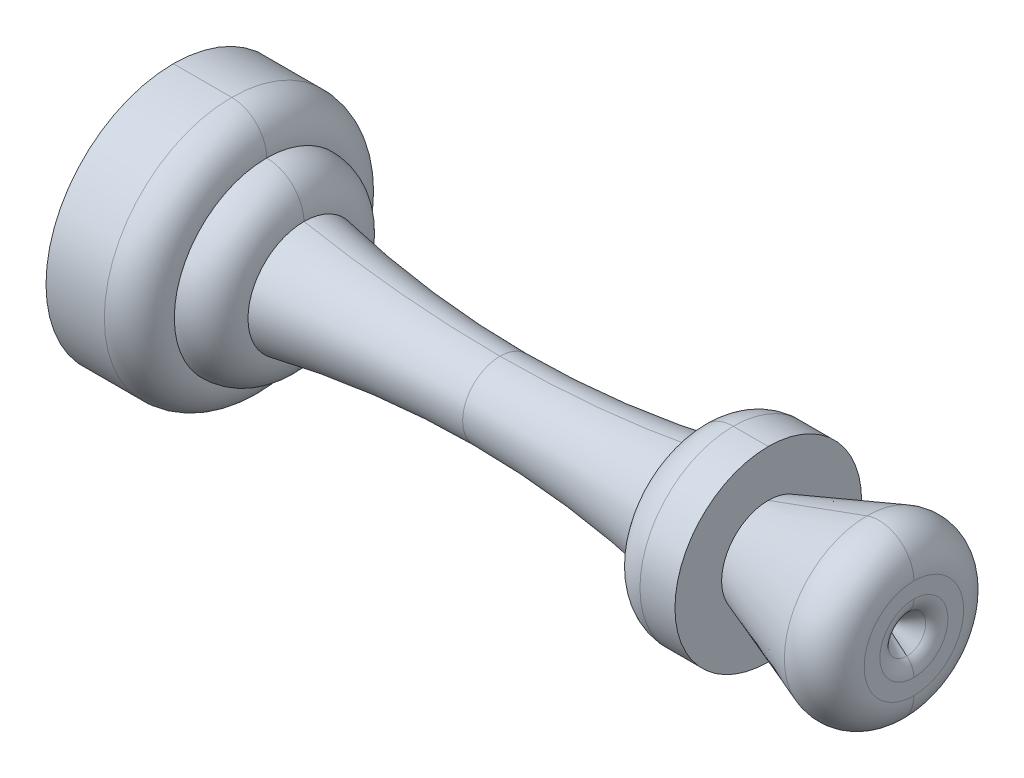
ISO-10303-21;
HEADER;
FILE_DESCRIPTION(('STEP AP214'),'2;1');
FILE_NAME('part.step','',(''),(''),'','','');
FILE_SCHEMA(('AUTOMOTIVE_DESIGN { 1 0 10303 214 1 1 1 1 }'));
ENDSEC;
DATA;
#1=APPLICATION_CONTEXT('core data for automotive mechanical design processes');
#2=APPLICATION_PROTOCOL_DEFINITION('international standard','automotive_design',2000,#1);
#3=PRODUCT_CONTEXT('',#1,'mechanical');
#4=PRODUCT('Part','Part','',(#3));
#5=PRODUCT_RELATED_PRODUCT_CATEGORY('part','',(#4));
#6=PRODUCT_DEFINITION_FORMATION('','',#4);
#7=PRODUCT_DEFINITION_CONTEXT('part definition',#1,'design');
#8=PRODUCT_DEFINITION('design','',#6,#7);
#9=PRODUCT_DEFINITION_SHAPE('','',#8);
#10=(LENGTH_UNIT() NAMED_UNIT(*) SI_UNIT(.MILLI.,.METRE.));
#11=(NAMED_UNIT(*) PLANE_ANGLE_UNIT() SI_UNIT($,.RADIAN.));
#12=(NAMED_UNIT(*) SI_UNIT($,.STERADIAN.) SOLID_ANGLE_UNIT());
#13=UNCERTAINTY_MEASURE_WITH_UNIT(LENGTH_MEASURE(1.E-05),#10,'distance_accuracy_value','');
#14=(GEOMETRIC_REPRESENTATION_CONTEXT(3) GLOBAL_UNCERTAINTY_ASSIGNED_CONTEXT((#13)) GLOBAL_UNIT_ASSIGNED_CONTEXT((#10,
#11,#12)) REPRESENTATION_CONTEXT('',''));
#15=CARTESIAN_POINT('',(0.,0.,0.));
#16=DIRECTION('',(0.,0.,1.));
#17=DIRECTION('',(1.,0.,0.));
#18=AXIS2_PLACEMENT_3D('',#15,#16,#17);
#19=CARTESIAN_POINT('',(0.,10.9184262916031,0.));
#20=DIRECTION('',(-1.,0.,0.));
#21=DIRECTION('',(0.,-1.,0.));
#22=AXIS2_PLACEMENT_3D('',#19,#20,#21);
#23=CYLINDRICAL_SURFACE('',#22,10.9184262916031);
#24=DIRECTION('',(-1.,0.,0.));
#25=VECTOR('',#24,1.);
#26=CARTESIAN_POINT('',(0.,21.8368525832062,0.));
#27=LINE('',#26,#25);
#28=CARTESIAN_POINT('',(5.,21.8368525832062,0.));
#29=VERTEX_POINT('',#28);
#30=CARTESIAN_POINT('',(0.,21.8368525832062,0.));
#31=VERTEX_POINT('',#30);
#32=EDGE_CURVE('E235',#29,#31,#27,.T.);
#33=ORIENTED_EDGE('',*,*,#32,.F.);
#34=CARTESIAN_POINT('',(5.,10.9184262916031,0.));
#35=DIRECTION('',(-1.,0.,0.));
#36=DIRECTION('',(0.,-1.,0.));
#37=AXIS2_PLACEMENT_3D('',#34,#35,#36);
#38=CIRCLE('',#37,10.9184262916031);
#39=CARTESIAN_POINT('',(5.,0.,0.));
#40=VERTEX_POINT('',#39);
#41=EDGE_CURVE('E341',#29,#40,#38,.T.);
#42=ORIENTED_EDGE('',*,*,#41,.T.);
#43=DIRECTION('',(-1.,0.,0.));
#44=VECTOR('',#43,1.);
#45=CARTESIAN_POINT('',(0.,0.,0.));
#46=LINE('',#45,#44);
#47=CARTESIAN_POINT('',(0.,0.,0.));
#48=VERTEX_POINT('',#47);
#49=EDGE_CURVE('E243',#40,#48,#46,.T.);
#50=ORIENTED_EDGE('',*,*,#49,.T.);
#51=CARTESIAN_POINT('',(0.,10.9184262916031,0.));
#52=DIRECTION('',(-1.,0.,0.));
#53=DIRECTION('',(0.,-1.,0.));
#54=AXIS2_PLACEMENT_3D('',#51,#52,#53);
#55=CIRCLE('',#54,10.9184262916031);
#56=EDGE_CURVE('E362',#31,#48,#55,.T.);
#57=ORIENTED_EDGE('',*,*,#56,.F.);
#58=EDGE_LOOP('',(#33,#42,#50,#57));
#59=FACE_BOUND('',#58,.T.);
#60=ADVANCED_FACE('F16',(#59),#23,.T.);
#61=CARTESIAN_POINT('',(0.,0.,0.));
#62=DIRECTION('',(1.,0.,0.));
#63=DIRECTION('',(0.,1.,0.));
#64=AXIS2_PLACEMENT_3D('',#61,#62,#63);
#65=PLANE('',#64);
#66=CARTESIAN_POINT('',(0.,10.9184262916031,0.));
#67=DIRECTION('',(-1.,0.,0.));
#68=DIRECTION('',(0.,-1.,0.));
#69=AXIS2_PLACEMENT_3D('',#66,#67,#68);
#70=CIRCLE('',#69,10.9184262916031);
#71=EDGE_CURVE('E239',#48,#31,#70,.T.);
#72=ORIENTED_EDGE('',*,*,#71,.T.);
#73=ORIENTED_EDGE('',*,*,#56,.T.);
#74=EDGE_LOOP('',(#72,#73));
#75=FACE_BOUND('',#74,.T.);
#76=ADVANCED_FACE('F401',(#75),#65,.F.);
#77=CARTESIAN_POINT('',(62.8795706103014,10.9184262916031,0.));
#78=DIRECTION('',(1.,0.,0.));
#79=DIRECTION('',(0.,1.,0.));
#80=AXIS2_PLACEMENT_3D('',#77,#78,#79);
#81=CONICAL_SURFACE('',#80,1.61920740262645,0.698131700797723);
#82=DIRECTION('',(0.766044443118984,-0.642787609686533,0.));
#83=VECTOR('',#82,1.);
#84=CARTESIAN_POINT('',(62.8795706103014,9.29921888897666,0.));
#85=LINE('',#84,#83);
#86=CARTESIAN_POINT('',(60.9498743710662,10.9184262916031,0.));
#87=VERTEX_POINT('',#86);
#88=CARTESIAN_POINT('',(62.8795706103014,9.29921888897666,0.));
#89=VERTEX_POINT('',#88);
#90=EDGE_CURVE('E261',#87,#89,#85,.T.);
#91=ORIENTED_EDGE('',*,*,#90,.F.);
#92=DIRECTION('',(0.766044443118984,0.642787609686533,0.));
#93=VECTOR('',#92,1.);
#94=CARTESIAN_POINT('',(62.8795706103014,12.5376336942296,0.));
#95=LINE('',#94,#93);
#96=CARTESIAN_POINT('',(62.8795706103014,12.5376336942296,0.));
#97=VERTEX_POINT('',#96);
#98=EDGE_CURVE('E247',#87,#97,#95,.T.);
#99=ORIENTED_EDGE('',*,*,#98,.T.);
#100=CARTESIAN_POINT('',(62.8795706103014,10.9184262916031,0.));
#101=DIRECTION('',(-1.,0.,0.));
#102=DIRECTION('',(0.,-1.,0.));
#103=AXIS2_PLACEMENT_3D('',#100,#101,#102);
#104=CIRCLE('',#103,1.61920740262645);
#105=EDGE_CURVE('E253',#89,#97,#104,.T.);
#106=ORIENTED_EDGE('',*,*,#105,.F.);
#107=EDGE_LOOP('',(#91,#99,#106));
#108=FACE_BOUND('',#107,.T.);
#109=ADVANCED_FACE('F405',(#108),#81,.F.);
#110=CARTESIAN_POINT('',(61.7933472037961,10.9184262916031,0.));
#111=DIRECTION('',(-1.,0.,0.));
#112=DIRECTION('',(0.,-1.,0.));
#113=AXIS2_PLACEMENT_3D('',#110,#111,#112);
#114=TOROIDAL_SURFACE('',#113,2.91371804968909,1.68986363479379);
#115=CARTESIAN_POINT('',(61.7933472037961,13.8321443412922,0.));
#116=DIRECTION('',(0.,0.,1.));
#117=DIRECTION('',(0.,-1.,0.));
#118=AXIS2_PLACEMENT_3D('',#115,#116,#117);
#119=CIRCLE('',#118,1.68986363479379);
#120=CARTESIAN_POINT('',(63.4832108385899,13.8321443412922,0.));
#121=VERTEX_POINT('',#120);
#122=EDGE_CURVE('E223',#97,#121,#119,.T.);
#123=ORIENTED_EDGE('',*,*,#122,.F.);
#124=CARTESIAN_POINT('',(62.8795706103014,10.9184262916031,0.));
#125=DIRECTION('',(-1.,0.,0.));
#126=DIRECTION('',(0.,-1.,0.));
#127=AXIS2_PLACEMENT_3D('',#124,#125,#126);
#128=CIRCLE('',#127,1.61920740262645);
#129=EDGE_CURVE('E257',#97,#89,#128,.T.);
#130=ORIENTED_EDGE('',*,*,#129,.T.);
#131=CARTESIAN_POINT('',(61.7933472037961,8.00470824191402,0.));
#132=DIRECTION('',(0.,0.,-1.));
#133=DIRECTION('',(-1.,0.,0.));
#134=AXIS2_PLACEMENT_3D('',#131,#132,#133);
#135=CIRCLE('',#134,1.68986363479379);
#136=CARTESIAN_POINT('',(63.4832108385899,8.00470824191402,0.));
#137=VERTEX_POINT('',#136);
#138=EDGE_CURVE('E222',#89,#137,#135,.T.);
#139=ORIENTED_EDGE('',*,*,#138,.T.);
#140=CARTESIAN_POINT('',(63.4832108385899,10.9184262916031,0.));
#141=DIRECTION('',(-1.,0.,0.));
#142=DIRECTION('',(0.,-1.,0.));
#143=AXIS2_PLACEMENT_3D('',#140,#141,#142);
#144=CIRCLE('',#143,2.91371804968909);
#145=EDGE_CURVE('E359',#121,#137,#144,.T.);
#146=ORIENTED_EDGE('',*,*,#145,.F.);
#147=EDGE_LOOP('',(#123,#130,#139,#146));
#148=FACE_BOUND('',#147,.T.);
#149=ADVANCED_FACE('F409',(#148),#114,.T.);
#150=CARTESIAN_POINT('',(63.4832108385899,0.,0.));
#151=DIRECTION('',(1.,0.,0.));
#152=DIRECTION('',(0.,1.,0.));
#153=AXIS2_PLACEMENT_3D('',#150,#151,#152);
#154=PLANE('',#153);
#155=CARTESIAN_POINT('',(63.4832108385899,10.9184262916031,0.));
#156=DIRECTION('',(-1.,0.,0.));
#157=DIRECTION('',(0.,-1.,0.));
#158=AXIS2_PLACEMENT_3D('',#155,#156,#157);
#159=CIRCLE('',#158,2.91371804968909);
#160=EDGE_CURVE('E219',#137,#121,#159,.T.);
#161=ORIENTED_EDGE('',*,*,#160,.T.);
#162=ORIENTED_EDGE('',*,*,#145,.T.);
#163=EDGE_LOOP('',(#161,#162));
#164=FACE_BOUND('',#163,.T.);
#165=CARTESIAN_POINT('',(63.4832108385899,10.9184262916031,0.));
#166=DIRECTION('',(-1.,0.,0.));
#167=DIRECTION('',(0.,-1.,0.));
#168=AXIS2_PLACEMENT_3D('',#165,#166,#167);
#169=CIRCLE('',#168,4.25910342757334);
#170=CARTESIAN_POINT('',(63.4832108385899,6.65932286402978,0.));
#171=VERTEX_POINT('',#170);
#172=CARTESIAN_POINT('',(63.4832108385899,15.1775297191764,0.));
#173=VERTEX_POINT('',#172);
#174=EDGE_CURVE('E280',#171,#173,#169,.T.);
#175=ORIENTED_EDGE('',*,*,#174,.F.);
#176=CARTESIAN_POINT('',(63.4832108385899,10.9184262916031,0.));
#177=DIRECTION('',(-1.,0.,0.));
#178=DIRECTION('',(0.,-1.,0.));
#179=AXIS2_PLACEMENT_3D('',#176,#177,#178);
#180=CIRCLE('',#179,4.25910342757334);
#181=EDGE_CURVE('E356',#173,#171,#180,.T.);
#182=ORIENTED_EDGE('',*,*,#181,.F.);
#183=EDGE_LOOP('',(#175,#182));
#184=FACE_BOUND('',#183,.T.);
#185=ADVANCED_FACE('F413',(#164,#184),#154,.T.);
#186=CARTESIAN_POINT('',(60.4832108385899,10.9184262916031,0.));
#187=DIRECTION('',(-1.,0.,0.));
#188=DIRECTION('',(0.,-1.,0.));
#189=AXIS2_PLACEMENT_3D('',#186,#187,#188);
#190=TOROIDAL_SURFACE('',#189,4.25910342757334,3.);
#191=CARTESIAN_POINT('',(60.4832108385899,15.1775297191764,0.));
#192=DIRECTION('',(0.,0.,1.));
#193=DIRECTION('',(0.,-1.,0.));
#194=AXIS2_PLACEMENT_3D('',#191,#192,#193);
#195=CIRCLE('',#194,3.);
#196=CARTESIAN_POINT('',(59.4571504086129,17.9966075815342,0.));
#197=VERTEX_POINT('',#196);
#198=EDGE_CURVE('E284',#173,#197,#195,.T.);
#199=ORIENTED_EDGE('',*,*,#198,.F.);
#200=ORIENTED_EDGE('',*,*,#181,.T.);
#201=CARTESIAN_POINT('',(60.4832108385899,6.65932286402978,0.));
#202=DIRECTION('',(0.,0.,-1.));
#203=DIRECTION('',(-1.,0.,0.));
#204=AXIS2_PLACEMENT_3D('',#201,#202,#203);
#205=CIRCLE('',#204,3.);
#206=CARTESIAN_POINT('',(59.4571504086129,3.84024500167206,0.));
#207=VERTEX_POINT('',#206);
#208=EDGE_CURVE('E292',#171,#207,#205,.T.);
#209=ORIENTED_EDGE('',*,*,#208,.T.);
#210=CARTESIAN_POINT('',(59.4571504086129,10.9184262916031,0.));
#211=DIRECTION('',(-1.,0.,0.));
#212=DIRECTION('',(0.,-1.,0.));
#213=AXIS2_PLACEMENT_3D('',#210,#211,#212);
#214=CIRCLE('',#213,7.07818128993106);
#215=EDGE_CURVE('E353',#197,#207,#214,.T.);
#216=ORIENTED_EDGE('',*,*,#215,.F.);
#217=EDGE_LOOP('',(#199,#200,#209,#216));
#218=FACE_BOUND('',#217,.T.);
#219=ADVANCED_FACE('F417',(#218),#190,.T.);
#220=CARTESIAN_POINT('',(50.9999168215398,10.9184262916031,0.));
#221=DIRECTION('',(1.,0.,0.));
#222=DIRECTION('',(0.,1.,0.));
#223=AXIS2_PLACEMENT_3D('',#220,#221,#222);
#224=CONICAL_SURFACE('',#223,4.,0.34906585039887);
#225=DIRECTION('',(0.939692620785907,-0.342020143325672,0.));
#226=VECTOR('',#225,1.);
#227=CARTESIAN_POINT('',(50.9999168215398,6.91842629160311,0.));
#228=LINE('',#227,#226);
#229=CARTESIAN_POINT('',(50.9999168215398,6.91842629160311,0.));
#230=VERTEX_POINT('',#229);
#231=EDGE_CURVE('E300',#230,#207,#228,.T.);
#232=ORIENTED_EDGE('',*,*,#231,.F.);
#233=CARTESIAN_POINT('',(50.9999168215398,10.9184262916031,0.));
#234=DIRECTION('',(-1.,0.,0.));
#235=DIRECTION('',(0.,-1.,0.));
#236=AXIS2_PLACEMENT_3D('',#233,#234,#235);
#237=CIRCLE('',#236,4.);
#238=CARTESIAN_POINT('',(50.9999168215398,14.9184262916031,0.));
#239=VERTEX_POINT('',#238);
#240=EDGE_CURVE('E350',#239,#230,#237,.T.);
#241=ORIENTED_EDGE('',*,*,#240,.F.);
#242=DIRECTION('',(0.939692620785907,0.342020143325672,0.));
#243=VECTOR('',#242,1.);
#244=CARTESIAN_POINT('',(50.9999168215398,14.9184262916031,0.));
#245=LINE('',#244,#243);
#246=EDGE_CURVE('E304',#239,#197,#245,.T.);
#247=ORIENTED_EDGE('',*,*,#246,.T.);
#248=ORIENTED_EDGE('',*,*,#215,.T.);
#249=EDGE_LOOP('',(#232,#241,#247,#248));
#250=FACE_BOUND('',#249,.T.);
#251=ADVANCED_FACE('F421',(#250),#224,.T.);
#252=CARTESIAN_POINT('',(50.9999168215398,0.,0.));
#253=DIRECTION('',(1.,0.,0.));
#254=DIRECTION('',(0.,1.,0.));
#255=AXIS2_PLACEMENT_3D('',#252,#253,#254);
#256=PLANE('',#255);
#257=ORIENTED_EDGE('',*,*,#240,.T.);
#258=CARTESIAN_POINT('',(50.9999168215398,10.9184262916031,0.));
#259=DIRECTION('',(-1.,0.,0.));
#260=DIRECTION('',(0.,-1.,0.));
#261=AXIS2_PLACEMENT_3D('',#258,#259,#260);
#262=CIRCLE('',#261,4.);
#263=EDGE_CURVE('E296',#230,#239,#262,.T.);
#264=ORIENTED_EDGE('',*,*,#263,.T.);
#265=EDGE_LOOP('',(#257,#264));
#266=FACE_BOUND('',#265,.T.);
#267=CARTESIAN_POINT('',(50.9999168215398,10.9184262916031,0.));
#268=DIRECTION('',(-1.,0.,0.));
#269=DIRECTION('',(0.,-1.,0.));
#270=AXIS2_PLACEMENT_3D('',#267,#268,#269);
#271=CIRCLE('',#270,8.);
#272=CARTESIAN_POINT('',(50.9999168215398,2.91842629160312,0.));
#273=VERTEX_POINT('',#272);
#274=CARTESIAN_POINT('',(50.9999168215398,18.9184262916031,0.));
#275=VERTEX_POINT('',#274);
#276=EDGE_CURVE('E252',#273,#275,#271,.T.);
#277=ORIENTED_EDGE('',*,*,#276,.F.);
#278=CARTESIAN_POINT('',(50.9999168215398,10.9184262916031,0.));
#279=DIRECTION('',(-1.,0.,0.));
#280=DIRECTION('',(0.,-1.,0.));
#281=AXIS2_PLACEMENT_3D('',#278,#279,#280);
#282=CIRCLE('',#281,8.);
#283=EDGE_CURVE('E347',#275,#273,#282,.T.);
#284=ORIENTED_EDGE('',*,*,#283,.F.);
#285=EDGE_LOOP('',(#277,#284));
#286=FACE_BOUND('',#285,.T.);
#287=ADVANCED_FACE('F425',(#266,#286),#256,.T.);
#288=CARTESIAN_POINT('',(0.,10.9184262916031,0.));
#289=DIRECTION('',(-1.,0.,0.));
#290=DIRECTION('',(0.,-1.,0.));
#291=AXIS2_PLACEMENT_3D('',#288,#289,#290);
#292=CYLINDRICAL_SURFACE('',#291,8.);
#293=DIRECTION('',(-1.,0.,0.));
#294=VECTOR('',#293,1.);
#295=CARTESIAN_POINT('',(0.,18.9184262916031,0.));
#296=LINE('',#295,#294);
#297=CARTESIAN_POINT('',(47.9999168215398,18.9184262916031,0.));
#298=VERTEX_POINT('',#297);
#299=EDGE_CURVE('E248',#275,#298,#296,.T.);
#300=ORIENTED_EDGE('',*,*,#299,.F.);
#301=ORIENTED_EDGE('',*,*,#283,.T.);
#302=DIRECTION('',(-1.,0.,0.));
#303=VECTOR('',#302,1.);
#304=CARTESIAN_POINT('',(0.,2.91842629160312,0.));
#305=LINE('',#304,#303);
#306=CARTESIAN_POINT('',(47.9999168215398,2.91842629160312,0.));
#307=VERTEX_POINT('',#306);
#308=EDGE_CURVE('E213',#273,#307,#305,.T.);
#309=ORIENTED_EDGE('',*,*,#308,.T.);
#310=CARTESIAN_POINT('',(47.9999168215398,10.9184262916031,0.));
#311=DIRECTION('',(-1.,0.,0.));
#312=DIRECTION('',(0.,-1.,0.));
#313=AXIS2_PLACEMENT_3D('',#310,#311,#312);
#314=CIRCLE('',#313,8.);
#315=EDGE_CURVE('E344',#298,#307,#314,.T.);
#316=ORIENTED_EDGE('',*,*,#315,.F.);
#317=EDGE_LOOP('',(#300,#301,#309,#316));
#318=FACE_BOUND('',#317,.T.);
#319=ADVANCED_FACE('F429',(#318),#292,.T.);
#320=CARTESIAN_POINT('',(47.9999168215398,10.9184262916031,0.));
#321=DIRECTION('',(-1.,0.,0.));
#322=DIRECTION('',(0.,-1.,0.));
#323=AXIS2_PLACEMENT_3D('',#320,#321,#322);
#324=TOROIDAL_SURFACE('',#323,4.8,3.2);
#325=CARTESIAN_POINT('',(47.9999168215398,15.7184262916031,0.));
#326=DIRECTION('',(0.,0.,1.));
#327=DIRECTION('',(0.,-1.,0.));
#328=AXIS2_PLACEMENT_3D('',#325,#326,#327);
#329=CIRCLE('',#328,3.2);
#330=CARTESIAN_POINT('',(44.7999168215397,15.7184262916031,0.));
#331=VERTEX_POINT('',#330);
#332=EDGE_CURVE('E217',#298,#331,#329,.T.);
#333=ORIENTED_EDGE('',*,*,#332,.F.);
#334=ORIENTED_EDGE('',*,*,#315,.T.);
#335=CARTESIAN_POINT('',(47.9999168215398,6.11842629160312,0.));
#336=DIRECTION('',(0.,0.,-1.));
#337=DIRECTION('',(-1.,0.,0.));
#338=AXIS2_PLACEMENT_3D('',#335,#336,#337);
#339=CIRCLE('',#338,3.2);
#340=CARTESIAN_POINT('',(44.7999168215397,6.11842629160312,0.));
#341=VERTEX_POINT('',#340);
#342=EDGE_CURVE('E230',#307,#341,#339,.T.);
#343=ORIENTED_EDGE('',*,*,#342,.T.);
#344=CARTESIAN_POINT('',(44.7999168215397,10.9184262916031,0.));
#345=DIRECTION('',(-1.,0.,0.));
#346=DIRECTION('',(0.,-1.,0.));
#347=AXIS2_PLACEMENT_3D('',#344,#345,#346);
#348=CIRCLE('',#347,4.8);
#349=EDGE_CURVE('E262',#331,#341,#348,.T.);
#350=ORIENTED_EDGE('',*,*,#349,.F.);
#351=EDGE_LOOP('',(#333,#334,#343,#350));
#352=FACE_BOUND('',#351,.T.);
#353=ADVANCED_FACE('F433',(#352),#324,.T.);
#354=CARTESIAN_POINT('',(27.9994384614503,10.9184262916031,0.));
#355=DIRECTION('',(-1.,0.,0.));
#356=DIRECTION('',(0.,-1.,0.));
#357=AXIS2_PLACEMENT_3D('',#354,#355,#356);
#358=TOROIDAL_SURFACE('',#357,92.1999080484194,89.);
#359=CARTESIAN_POINT('',(27.9994384614503,10.9184262916031,0.));
#360=DIRECTION('',(-1.,0.,0.));
#361=DIRECTION('',(0.,-1.,0.));
#362=AXIS2_PLACEMENT_3D('',#359,#360,#361);
#363=CIRCLE('',#362,3.19990804841939);
#364=CARTESIAN_POINT('',(27.9994384614503,7.71851824318372,0.));
#365=VERTEX_POINT('',#364);
#366=CARTESIAN_POINT('',(27.9994384614503,14.1183343400225,0.));
#367=VERTEX_POINT('',#366);
#368=EDGE_CURVE('E204',#365,#367,#363,.T.);
#369=ORIENTED_EDGE('',*,*,#368,.F.);
#370=CARTESIAN_POINT('',(27.9994384614503,-81.2814817568163,0.));
#371=DIRECTION('',(0.,0.,-1.));
#372=DIRECTION('',(-1.,0.,0.));
#373=AXIS2_PLACEMENT_3D('',#370,#371,#372);
#374=CIRCLE('',#373,89.);
#375=EDGE_CURVE('E266',#365,#341,#374,.T.);
#376=ORIENTED_EDGE('',*,*,#375,.T.);
#377=CARTESIAN_POINT('',(44.7999168215397,10.9184262916031,0.));
#378=DIRECTION('',(-1.,0.,0.));
#379=DIRECTION('',(0.,-1.,0.));
#380=AXIS2_PLACEMENT_3D('',#377,#378,#379);
#381=CIRCLE('',#380,4.8);
#382=EDGE_CURVE('E227',#341,#331,#381,.T.);
#383=ORIENTED_EDGE('',*,*,#382,.T.);
#384=CARTESIAN_POINT('',(27.9994384614503,103.118334340022,0.));
#385=DIRECTION('',(0.,0.,1.));
#386=DIRECTION('',(0.,-1.,0.));
#387=AXIS2_PLACEMENT_3D('',#384,#385,#386);
#388=CIRCLE('',#387,89.);
#389=EDGE_CURVE('E267',#367,#331,#388,.T.);
#390=ORIENTED_EDGE('',*,*,#389,.F.);
#391=EDGE_LOOP('',(#369,#376,#383,#390));
#392=FACE_BOUND('',#391,.T.);
#393=ADVANCED_FACE('F435',(#392),#358,.F.);
#394=CARTESIAN_POINT('',(8.,10.9184262916031,0.));
#395=DIRECTION('',(-1.,0.,0.));
#396=DIRECTION('',(0.,-1.,0.));
#397=AXIS2_PLACEMENT_3D('',#394,#395,#396);
#398=TOROIDAL_SURFACE('',#397,4.71842629160311,3.2);
#399=CARTESIAN_POINT('',(8.,15.6368525832062,0.));
#400=DIRECTION('',(0.,0.,1.));
#401=DIRECTION('',(0.,-1.,0.));
#402=AXIS2_PLACEMENT_3D('',#399,#400,#401);
#403=CIRCLE('',#402,3.2);
#404=CARTESIAN_POINT('',(11.1989601013608,15.7184262916031,0.));
#405=VERTEX_POINT('',#404);
#406=CARTESIAN_POINT('',(8.,18.8368525832063,0.));
#407=VERTEX_POINT('',#406);
#408=EDGE_CURVE('E183',#405,#407,#403,.T.);
#409=ORIENTED_EDGE('',*,*,#408,.F.);
#410=CARTESIAN_POINT('',(11.1989601013608,10.9184262916031,0.));
#411=DIRECTION('',(-1.,0.,0.));
#412=DIRECTION('',(0.,-1.,0.));
#413=AXIS2_PLACEMENT_3D('',#410,#411,#412);
#414=CIRCLE('',#413,4.8);
#415=CARTESIAN_POINT('',(11.1989601013608,6.11842629160311,0.));
#416=VERTEX_POINT('',#415);
#417=EDGE_CURVE('E181',#405,#416,#414,.T.);
#418=ORIENTED_EDGE('',*,*,#417,.T.);
#419=CARTESIAN_POINT('',(8.,6.2,0.));
#420=DIRECTION('',(0.,0.,-1.));
#421=DIRECTION('',(-1.,0.,0.));
#422=AXIS2_PLACEMENT_3D('',#419,#420,#421);
#423=CIRCLE('',#422,3.2);
#424=CARTESIAN_POINT('',(8.,3.,0.));
#425=VERTEX_POINT('',#424);
#426=EDGE_CURVE('E167',#416,#425,#423,.T.);
#427=ORIENTED_EDGE('',*,*,#426,.T.);
#428=CARTESIAN_POINT('',(8.,10.9184262916031,0.));
#429=DIRECTION('',(-1.,0.,0.));
#430=DIRECTION('',(0.,-1.,0.));
#431=AXIS2_PLACEMENT_3D('',#428,#429,#430);
#432=CIRCLE('',#431,7.91842629160311);
#433=EDGE_CURVE('E338',#407,#425,#432,.T.);
#434=ORIENTED_EDGE('',*,*,#433,.F.);
#435=EDGE_LOOP('',(#409,#418,#427,#434));
#436=FACE_BOUND('',#435,.T.);
#437=ADVANCED_FACE('F182',(#436),#398,.T.);
#438=CARTESIAN_POINT('',(5.,10.9184262916031,0.));
#439=DIRECTION('',(-1.,0.,0.));
#440=DIRECTION('',(0.,-1.,0.));
#441=AXIS2_PLACEMENT_3D('',#438,#439,#440);
#442=TOROIDAL_SURFACE('',#441,7.91842629160311,3.);
#443=CARTESIAN_POINT('',(5.,18.8368525832063,0.));
#444=DIRECTION('',(0.,0.,1.));
#445=DIRECTION('',(0.,-1.,0.));
#446=AXIS2_PLACEMENT_3D('',#443,#444,#445);
#447=CIRCLE('',#446,3.);
#448=EDGE_CURVE('E178',#407,#29,#447,.T.);
#449=ORIENTED_EDGE('',*,*,#448,.F.);
#450=ORIENTED_EDGE('',*,*,#433,.T.);
#451=CARTESIAN_POINT('',(5.,3.,0.));
#452=DIRECTION('',(0.,0.,-1.));
#453=DIRECTION('',(-1.,0.,0.));
#454=AXIS2_PLACEMENT_3D('',#451,#452,#453);
#455=CIRCLE('',#454,3.);
#456=EDGE_CURVE('E334',#425,#40,#455,.T.);
#457=ORIENTED_EDGE('',*,*,#456,.T.);
#458=ORIENTED_EDGE('',*,*,#41,.F.);
#459=EDGE_LOOP('',(#449,#450,#457,#458));
#460=FACE_BOUND('',#459,.T.);
#461=ADVANCED_FACE('F441',(#460),#442,.T.);
#462=CARTESIAN_POINT('',(5.,10.9184262916031,0.));
#463=DIRECTION('',(-1.,0.,0.));
#464=DIRECTION('',(0.,-1.,0.));
#465=AXIS2_PLACEMENT_3D('',#462,#463,#464);
#466=TOROIDAL_SURFACE('',#465,7.91842629160311,3.);
#467=CARTESIAN_POINT('',(8.,10.9184262916031,0.));
#468=DIRECTION('',(-1.,0.,0.));
#469=DIRECTION('',(0.,-1.,0.));
#470=AXIS2_PLACEMENT_3D('',#467,#468,#469);
#471=CIRCLE('',#470,7.91842629160311);
#472=EDGE_CURVE('E175',#425,#407,#471,.T.);
#473=ORIENTED_EDGE('',*,*,#472,.T.);
#474=ORIENTED_EDGE('',*,*,#448,.T.);
#475=CARTESIAN_POINT('',(5.,10.9184262916031,0.));
#476=DIRECTION('',(-1.,0.,0.));
#477=DIRECTION('',(0.,-1.,0.));
#478=AXIS2_PLACEMENT_3D('',#475,#476,#477);
#479=CIRCLE('',#478,10.9184262916031);
#480=EDGE_CURVE('E188',#40,#29,#479,.T.);
#481=ORIENTED_EDGE('',*,*,#480,.F.);
#482=ORIENTED_EDGE('',*,*,#456,.F.);
#483=EDGE_LOOP('',(#473,#474,#481,#482));
#484=FACE_BOUND('',#483,.T.);
#485=ADVANCED_FACE('F444',(#484),#466,.T.);
#486=CARTESIAN_POINT('',(8.,10.9184262916031,0.));
#487=DIRECTION('',(-1.,0.,0.));
#488=DIRECTION('',(0.,-1.,0.));
#489=AXIS2_PLACEMENT_3D('',#486,#487,#488);
#490=TOROIDAL_SURFACE('',#489,4.71842629160311,3.2);
#491=CARTESIAN_POINT('',(11.1989601013608,10.9184262916031,0.));
#492=DIRECTION('',(-1.,0.,0.));
#493=DIRECTION('',(0.,-1.,0.));
#494=AXIS2_PLACEMENT_3D('',#491,#492,#493);
#495=CIRCLE('',#494,4.8);
#496=EDGE_CURVE('E172',#416,#405,#495,.T.);
#497=ORIENTED_EDGE('',*,*,#496,.T.);
#498=ORIENTED_EDGE('',*,*,#408,.T.);
#499=ORIENTED_EDGE('',*,*,#472,.F.);
#500=ORIENTED_EDGE('',*,*,#426,.F.);
#501=EDGE_LOOP('',(#497,#498,#499,#500));
#502=FACE_BOUND('',#501,.T.);
#503=ADVANCED_FACE('F169',(#502),#490,.T.);
#504=CARTESIAN_POINT('',(27.9994384614503,10.9184262916031,0.));
#505=DIRECTION('',(-1.,0.,0.));
#506=DIRECTION('',(0.,-1.,0.));
#507=AXIS2_PLACEMENT_3D('',#504,#505,#506);
#508=TOROIDAL_SURFACE('',#507,92.1999080484194,89.);
#509=CARTESIAN_POINT('',(27.9994384614503,10.9184262916031,0.));
#510=DIRECTION('',(-1.,0.,0.));
#511=DIRECTION('',(0.,-1.,0.));
#512=AXIS2_PLACEMENT_3D('',#509,#510,#511);
#513=CIRCLE('',#512,3.19990804841939);
#514=EDGE_CURVE('E189',#367,#365,#513,.T.);
#515=ORIENTED_EDGE('',*,*,#514,.F.);
#516=ORIENTED_EDGE('',*,*,#389,.T.);
#517=ORIENTED_EDGE('',*,*,#349,.T.);
#518=ORIENTED_EDGE('',*,*,#375,.F.);
#519=EDGE_LOOP('',(#515,#516,#517,#518));
#520=FACE_BOUND('',#519,.T.);
#521=ADVANCED_FACE('F453',(#520),#508,.F.);
#522=CARTESIAN_POINT('',(47.9999168215398,10.9184262916031,0.));
#523=DIRECTION('',(-1.,0.,0.));
#524=DIRECTION('',(0.,-1.,0.));
#525=AXIS2_PLACEMENT_3D('',#522,#523,#524);
#526=TOROIDAL_SURFACE('',#525,4.8,3.2);
#527=CARTESIAN_POINT('',(47.9999168215398,10.9184262916031,0.));
#528=DIRECTION('',(-1.,0.,0.));
#529=DIRECTION('',(0.,-1.,0.));
#530=AXIS2_PLACEMENT_3D('',#527,#528,#529);
#531=CIRCLE('',#530,8.);
#532=EDGE_CURVE('E218',#307,#298,#531,.T.);
#533=ORIENTED_EDGE('',*,*,#532,.T.);
#534=ORIENTED_EDGE('',*,*,#332,.T.);
#535=ORIENTED_EDGE('',*,*,#382,.F.);
#536=ORIENTED_EDGE('',*,*,#342,.F.);
#537=EDGE_LOOP('',(#533,#534,#535,#536));
#538=FACE_BOUND('',#537,.T.);
#539=ADVANCED_FACE('F449',(#538),#526,.T.);
#540=CARTESIAN_POINT('',(0.,10.9184262916031,0.));
#541=DIRECTION('',(-1.,0.,0.));
#542=DIRECTION('',(0.,-1.,0.));
#543=AXIS2_PLACEMENT_3D('',#540,#541,#542);
#544=CYLINDRICAL_SURFACE('',#543,8.);
#545=ORIENTED_EDGE('',*,*,#276,.T.);
#546=ORIENTED_EDGE('',*,*,#299,.T.);
#547=ORIENTED_EDGE('',*,*,#532,.F.);
#548=ORIENTED_EDGE('',*,*,#308,.F.);
#549=EDGE_LOOP('',(#545,#546,#547,#548));
#550=FACE_BOUND('',#549,.T.);
#551=ADVANCED_FACE('F452',(#550),#544,.T.);
#552=CARTESIAN_POINT('',(50.9999168215398,10.9184262916031,0.));
#553=DIRECTION('',(1.,0.,0.));
#554=DIRECTION('',(0.,1.,0.));
#555=AXIS2_PLACEMENT_3D('',#552,#553,#554);
#556=CONICAL_SURFACE('',#555,4.,0.34906585039887);
#557=ORIENTED_EDGE('',*,*,#263,.F.);
#558=ORIENTED_EDGE('',*,*,#231,.T.);
#559=CARTESIAN_POINT('',(59.4571504086129,10.9184262916031,0.));
#560=DIRECTION('',(-1.,0.,0.));
#561=DIRECTION('',(0.,-1.,0.));
#562=AXIS2_PLACEMENT_3D('',#559,#560,#561);
#563=CIRCLE('',#562,7.07818128993106);
#564=EDGE_CURVE('E288',#207,#197,#563,.T.);
#565=ORIENTED_EDGE('',*,*,#564,.T.);
#566=ORIENTED_EDGE('',*,*,#246,.F.);
#567=EDGE_LOOP('',(#557,#558,#565,#566));
#568=FACE_BOUND('',#567,.T.);
#569=ADVANCED_FACE('F462',(#568),#556,.T.);
#570=CARTESIAN_POINT('',(60.4832108385899,10.9184262916031,0.));
#571=DIRECTION('',(-1.,0.,0.));
#572=DIRECTION('',(0.,-1.,0.));
#573=AXIS2_PLACEMENT_3D('',#570,#571,#572);
#574=TOROIDAL_SURFACE('',#573,4.25910342757334,3.);
#575=ORIENTED_EDGE('',*,*,#174,.T.);
#576=ORIENTED_EDGE('',*,*,#198,.T.);
#577=ORIENTED_EDGE('',*,*,#564,.F.);
#578=ORIENTED_EDGE('',*,*,#208,.F.);
#579=EDGE_LOOP('',(#575,#576,#577,#578));
#580=FACE_BOUND('',#579,.T.);
#581=ADVANCED_FACE('F466',(#580),#574,.T.);
#582=CARTESIAN_POINT('',(61.7933472037961,10.9184262916031,0.));
#583=DIRECTION('',(-1.,0.,0.));
#584=DIRECTION('',(0.,-1.,0.));
#585=AXIS2_PLACEMENT_3D('',#582,#583,#584);
#586=TOROIDAL_SURFACE('',#585,2.91371804968909,1.68986363479379);
#587=ORIENTED_EDGE('',*,*,#105,.T.);
#588=ORIENTED_EDGE('',*,*,#122,.T.);
#589=ORIENTED_EDGE('',*,*,#160,.F.);
#590=ORIENTED_EDGE('',*,*,#138,.F.);
#591=EDGE_LOOP('',(#587,#588,#589,#590));
#592=FACE_BOUND('',#591,.T.);
#593=ADVANCED_FACE('F471',(#592),#586,.T.);
#594=CARTESIAN_POINT('',(62.8795706103014,10.9184262916031,0.));
#595=DIRECTION('',(1.,0.,0.));
#596=DIRECTION('',(0.,1.,0.));
#597=AXIS2_PLACEMENT_3D('',#594,#595,#596);
#598=CONICAL_SURFACE('',#597,1.61920740262645,0.698131700797723);
#599=ORIENTED_EDGE('',*,*,#98,.F.);
#600=ORIENTED_EDGE('',*,*,#90,.T.);
#601=ORIENTED_EDGE('',*,*,#129,.F.);
#602=EDGE_LOOP('',(#599,#600,#601));
#603=FACE_BOUND('',#602,.T.);
#604=ADVANCED_FACE('F474',(#603),#598,.F.);
#605=CARTESIAN_POINT('',(0.,10.9184262916031,0.));
#606=DIRECTION('',(-1.,0.,0.));
#607=DIRECTION('',(0.,-1.,0.));
#608=AXIS2_PLACEMENT_3D('',#605,#606,#607);
#609=CYLINDRICAL_SURFACE('',#608,10.9184262916031);
#610=ORIENTED_EDGE('',*,*,#480,.T.);
#611=ORIENTED_EDGE('',*,*,#32,.T.);
#612=ORIENTED_EDGE('',*,*,#71,.F.);
#613=ORIENTED_EDGE('',*,*,#49,.F.);
#614=EDGE_LOOP('',(#610,#611,#612,#613));
#615=FACE_BOUND('',#614,.T.);
#616=ADVANCED_FACE('F478',(#615),#609,.T.);
#617=CARTESIAN_POINT('',(27.9994384614503,10.9184262916031,0.));
#618=DIRECTION('',(-1.,0.,0.));
#619=DIRECTION('',(0.,-1.,0.));
#620=AXIS2_PLACEMENT_3D('',#617,#618,#619);
#621=TOROIDAL_SURFACE('',#620,92.1999080484194,89.);
#622=CARTESIAN_POINT('',(27.9994384614503,103.118334340022,0.));
#623=DIRECTION('',(0.,0.,1.));
#624=DIRECTION('',(0.,-1.,0.));
#625=AXIS2_PLACEMENT_3D('',#622,#623,#624);
#626=CIRCLE('',#625,89.);
#627=EDGE_CURVE('E196',#405,#367,#626,.T.);
#628=ORIENTED_EDGE('',*,*,#627,.T.);
#629=ORIENTED_EDGE('',*,*,#514,.T.);
#630=CARTESIAN_POINT('',(27.9994384614503,-81.2814817568163,0.));
#631=DIRECTION('',(0.,0.,-1.));
#632=DIRECTION('',(-1.,0.,0.));
#633=AXIS2_PLACEMENT_3D('',#630,#631,#632);
#634=CIRCLE('',#633,89.);
#635=EDGE_CURVE('E195',#416,#365,#634,.T.);
#636=ORIENTED_EDGE('',*,*,#635,.F.);
#637=ORIENTED_EDGE('',*,*,#417,.F.);
#638=EDGE_LOOP('',(#628,#629,#636,#637));
#639=FACE_BOUND('',#638,.T.);
#640=ADVANCED_FACE('F200',(#639),#621,.F.);
#641=CARTESIAN_POINT('',(27.9994384614503,10.9184262916031,0.));
#642=DIRECTION('',(-1.,0.,0.));
#643=DIRECTION('',(0.,-1.,0.));
#644=AXIS2_PLACEMENT_3D('',#641,#642,#643);
#645=TOROIDAL_SURFACE('',#644,92.1999080484194,89.);
#646=ORIENTED_EDGE('',*,*,#635,.T.);
#647=ORIENTED_EDGE('',*,*,#368,.T.);
#648=ORIENTED_EDGE('',*,*,#627,.F.);
#649=ORIENTED_EDGE('',*,*,#496,.F.);
#650=EDGE_LOOP('',(#646,#647,#648,#649));
#651=FACE_BOUND('',#650,.T.);
#652=ADVANCED_FACE('F193',(#651),#645,.F.);
#653=CLOSED_SHELL('',(#60,#76,#109,#149,#185,#219,#251,#287,#319,#353,#393,#437,#461,#485,#503,
#521,#539,#551,#569,#581,#593,#604,#616,#640,#652));
#654=CARTESIAN_POINT('',(0.,10.9184262916031,0.));
#655=DIRECTION('',(-1.,0.,0.));
#656=DIRECTION('',(0.,-1.,0.));
#657=AXIS2_PLACEMENT_3D('',#654,#655,#656);
#658=CYLINDRICAL_SURFACE('',#657,10.3);
#659=DIRECTION('',(-1.,0.,0.));
#660=VECTOR('',#659,1.);
#661=CARTESIAN_POINT('',(0.,0.618426291603112,0.));
#662=LINE('',#661,#660);
#663=CARTESIAN_POINT('',(3.5,0.618426291603112,0.));
#664=VERTEX_POINT('',#663);
#665=CARTESIAN_POINT('',(1.,0.618426291603112,0.));
#666=VERTEX_POINT('',#665);
#667=EDGE_CURVE('E365',#664,#666,#662,.T.);
#668=ORIENTED_EDGE('',*,*,#667,.F.);
#669=CARTESIAN_POINT('',(3.5,10.9184262916031,0.));
#670=DIRECTION('',(-1.,0.,0.));
#671=DIRECTION('',(0.,-1.,0.));
#672=AXIS2_PLACEMENT_3D('',#669,#670,#671);
#673=CIRCLE('',#672,10.3);
#674=CARTESIAN_POINT('',(3.5,21.2184262916031,0.));
#675=VERTEX_POINT('',#674);
#676=EDGE_CURVE('E38',#675,#664,#673,.T.);
#677=ORIENTED_EDGE('',*,*,#676,.F.);
#678=DIRECTION('',(-1.,0.,0.));
#679=VECTOR('',#678,1.);
#680=CARTESIAN_POINT('',(0.,21.2184262916031,0.));
#681=LINE('',#680,#679);
#682=CARTESIAN_POINT('',(1.,21.2184262916031,0.));
#683=VERTEX_POINT('',#682);
#684=EDGE_CURVE('E46',#675,#683,#681,.T.);
#685=ORIENTED_EDGE('',*,*,#684,.T.);
#686=CARTESIAN_POINT('',(1.,10.9184262916031,0.));
#687=DIRECTION('',(-1.,0.,0.));
#688=DIRECTION('',(0.,-1.,0.));
#689=AXIS2_PLACEMENT_3D('',#686,#687,#688);
#690=CIRCLE('',#689,10.3);
#691=EDGE_CURVE('E368',#683,#666,#690,.T.);
#692=ORIENTED_EDGE('',*,*,#691,.T.);
#693=EDGE_LOOP('',(#668,#677,#685,#692));
#694=FACE_BOUND('',#693,.T.);
#695=ADVANCED_FACE('F378',(#694),#658,.F.);
#696=CARTESIAN_POINT('',(3.5,0.,0.));
#697=DIRECTION('',(1.,0.,0.));
#698=DIRECTION('',(0.,1.,0.));
#699=AXIS2_PLACEMENT_3D('',#696,#697,#698);
#700=PLANE('',#699);
#701=ORIENTED_EDGE('',*,*,#676,.T.);
#702=CARTESIAN_POINT('',(3.5,10.9184262916031,0.));
#703=DIRECTION('',(-1.,0.,0.));
#704=DIRECTION('',(0.,-1.,0.));
#705=AXIS2_PLACEMENT_3D('',#702,#703,#704);
#706=CIRCLE('',#705,10.3);
#707=EDGE_CURVE('E25',#664,#675,#706,.T.);
#708=ORIENTED_EDGE('',*,*,#707,.T.);
#709=EDGE_LOOP('',(#701,#708));
#710=FACE_BOUND('',#709,.T.);
#711=ADVANCED_FACE('F376',(#710),#700,.F.);
#712=CARTESIAN_POINT('',(0.,10.9184262916031,0.));
#713=DIRECTION('',(-1.,0.,0.));
#714=DIRECTION('',(0.,-1.,0.));
#715=AXIS2_PLACEMENT_3D('',#712,#713,#714);
#716=CYLINDRICAL_SURFACE('',#715,10.3);
#717=CARTESIAN_POINT('',(1.,10.9184262916031,0.));
#718=DIRECTION('',(-1.,0.,0.));
#719=DIRECTION('',(0.,-1.,0.));
#720=AXIS2_PLACEMENT_3D('',#717,#718,#719);
#721=CIRCLE('',#720,10.3);
#722=EDGE_CURVE('E9',#666,#683,#721,.T.);
#723=ORIENTED_EDGE('',*,*,#722,.T.);
#724=ORIENTED_EDGE('',*,*,#684,.F.);
#725=ORIENTED_EDGE('',*,*,#707,.F.);
#726=ORIENTED_EDGE('',*,*,#667,.T.);
#727=EDGE_LOOP('',(#723,#724,#725,#726));
#728=FACE_BOUND('',#727,.T.);
#729=ADVANCED_FACE('F382',(#728),#716,.F.);
#730=CARTESIAN_POINT('',(1.,0.,0.));
#731=DIRECTION('',(-1.,0.,0.));
#732=DIRECTION('',(0.,1.,0.));
#733=AXIS2_PLACEMENT_3D('',#730,#731,#732);
#734=PLANE('',#733);
#735=ORIENTED_EDGE('',*,*,#691,.F.);
#736=ORIENTED_EDGE('',*,*,#722,.F.);
#737=EDGE_LOOP('',(#735,#736));
#738=FACE_BOUND('',#737,.T.);
#739=ADVANCED_FACE('F18',(#738),#734,.F.);
#740=CLOSED_SHELL('',(#695,#711,#729,#739));
#741=ORIENTED_CLOSED_SHELL('',*,#740,.T.);
#742=BREP_WITH_VOIDS('B1',#653,(#741));
#743=ADVANCED_BREP_SHAPE_REPRESENTATION('',(#18,#742),#14);
#744=SHAPE_DEFINITION_REPRESENTATION(#9,#743);
ENDSEC;
END-ISO-10303-21;
